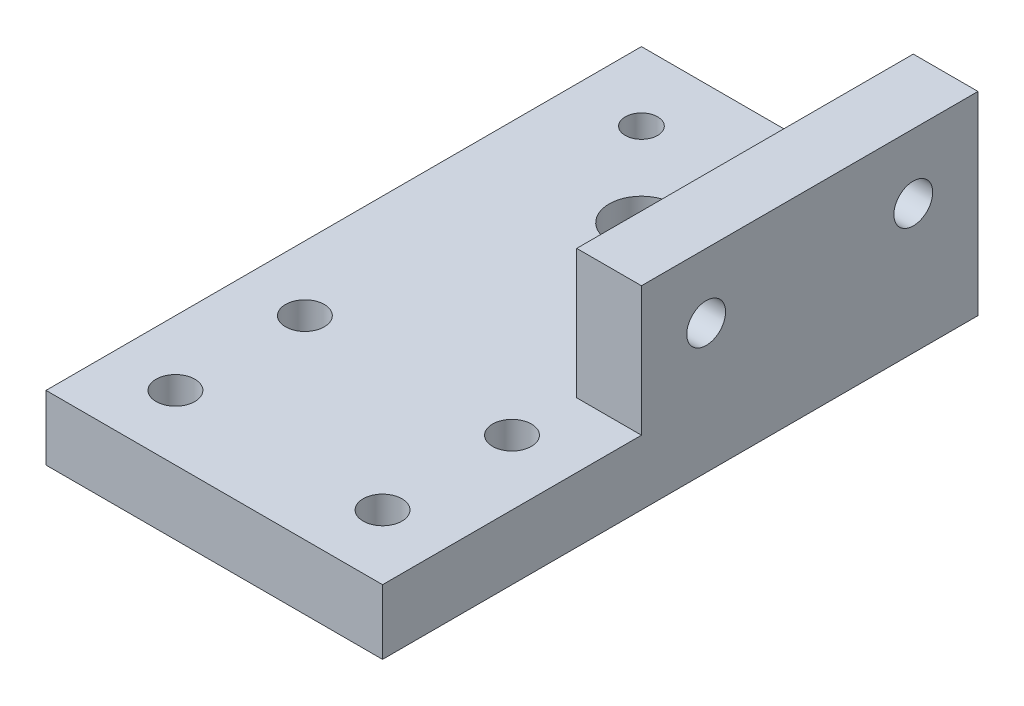
ISO-10303-21;
HEADER;
FILE_DESCRIPTION(('STEP AP214'),'2;1');
FILE_NAME('part.step','',(''),(''),'','','');
FILE_SCHEMA(('AUTOMOTIVE_DESIGN { 1 0 10303 214 1 1 1 1 }'));
ENDSEC;
DATA;
#1=APPLICATION_CONTEXT('core data for automotive mechanical design processes');
#2=APPLICATION_PROTOCOL_DEFINITION('international standard','automotive_design',2000,#1);
#3=PRODUCT_CONTEXT('',#1,'mechanical');
#4=PRODUCT('Part','Part','',(#3));
#5=PRODUCT_RELATED_PRODUCT_CATEGORY('part','',(#4));
#6=PRODUCT_DEFINITION_FORMATION('','',#4);
#7=PRODUCT_DEFINITION_CONTEXT('part definition',#1,'design');
#8=PRODUCT_DEFINITION('design','',#6,#7);
#9=PRODUCT_DEFINITION_SHAPE('','',#8);
#10=(LENGTH_UNIT() NAMED_UNIT(*) SI_UNIT(.MILLI.,.METRE.));
#11=(NAMED_UNIT(*) PLANE_ANGLE_UNIT() SI_UNIT($,.RADIAN.));
#12=(NAMED_UNIT(*) SI_UNIT($,.STERADIAN.) SOLID_ANGLE_UNIT());
#13=UNCERTAINTY_MEASURE_WITH_UNIT(LENGTH_MEASURE(1.E-05),#10,'distance_accuracy_value','');
#14=(GEOMETRIC_REPRESENTATION_CONTEXT(3) GLOBAL_UNCERTAINTY_ASSIGNED_CONTEXT((#13)) GLOBAL_UNIT_ASSIGNED_CONTEXT((#10,
#11,#12)) REPRESENTATION_CONTEXT('',''));
#15=CARTESIAN_POINT('',(0.,0.,0.));
#16=DIRECTION('',(0.,0.,1.));
#17=DIRECTION('',(1.,0.,0.));
#18=AXIS2_PLACEMENT_3D('',#15,#16,#17);
#19=CARTESIAN_POINT('',(0.,10.,-92.));
#20=DIRECTION('',(1.,0.,0.));
#21=DIRECTION('',(0.,0.,-1.));
#22=AXIS2_PLACEMENT_3D('',#19,#20,#21);
#23=PLANE('',#22);
#24=DIRECTION('',(0.,0.,1.));
#25=VECTOR('',#24,1.);
#26=CARTESIAN_POINT('',(0.,0.,-92.));
#27=LINE('',#26,#25);
#28=CARTESIAN_POINT('',(0.,0.,-92.));
#29=VERTEX_POINT('',#28);
#30=CARTESIAN_POINT('',(0.,0.,0.));
#31=VERTEX_POINT('',#30);
#32=EDGE_CURVE('E124',#29,#31,#27,.T.);
#33=ORIENTED_EDGE('',*,*,#32,.T.);
#34=DIRECTION('',(0.,-1.,0.));
#35=VECTOR('',#34,1.);
#36=CARTESIAN_POINT('',(0.,10.,0.));
#37=LINE('',#36,#35);
#38=CARTESIAN_POINT('',(0.,10.,0.));
#39=VERTEX_POINT('',#38);
#40=EDGE_CURVE('E11',#39,#31,#37,.T.);
#41=ORIENTED_EDGE('',*,*,#40,.F.);
#42=DIRECTION('',(0.,0.,1.));
#43=VECTOR('',#42,1.);
#44=CARTESIAN_POINT('',(0.,10.,-92.));
#45=LINE('',#44,#43);
#46=CARTESIAN_POINT('',(0.,10.,-92.));
#47=VERTEX_POINT('',#46);
#48=EDGE_CURVE('E135',#47,#39,#45,.T.);
#49=ORIENTED_EDGE('',*,*,#48,.F.);
#50=DIRECTION('',(0.,-1.,0.));
#51=VECTOR('',#50,1.);
#52=CARTESIAN_POINT('',(0.,10.,-92.));
#53=LINE('',#52,#51);
#54=EDGE_CURVE('E148',#47,#29,#53,.T.);
#55=ORIENTED_EDGE('',*,*,#54,.T.);
#56=EDGE_LOOP('',(#33,#41,#49,#55));
#57=FACE_BOUND('',#56,.T.);
#58=ADVANCED_FACE('F42',(#57),#23,.F.);
#59=CARTESIAN_POINT('',(0.,10.,0.));
#60=DIRECTION('',(0.,0.,-1.));
#61=DIRECTION('',(-1.,0.,0.));
#62=AXIS2_PLACEMENT_3D('',#59,#60,#61);
#63=PLANE('',#62);
#64=DIRECTION('',(1.,0.,0.));
#65=VECTOR('',#64,1.);
#66=CARTESIAN_POINT('',(0.,0.,0.));
#67=LINE('',#66,#65);
#68=CARTESIAN_POINT('',(52.,0.,0.));
#69=VERTEX_POINT('',#68);
#70=EDGE_CURVE('E129',#31,#69,#67,.T.);
#71=ORIENTED_EDGE('',*,*,#70,.T.);
#72=DIRECTION('',(0.,-1.,0.));
#73=VECTOR('',#72,1.);
#74=CARTESIAN_POINT('',(52.,10.,0.));
#75=LINE('',#74,#73);
#76=CARTESIAN_POINT('',(52.,10.,0.));
#77=VERTEX_POINT('',#76);
#78=EDGE_CURVE('E50',#77,#69,#75,.T.);
#79=ORIENTED_EDGE('',*,*,#78,.F.);
#80=DIRECTION('',(1.,0.,0.));
#81=VECTOR('',#80,1.);
#82=CARTESIAN_POINT('',(0.,10.,0.));
#83=LINE('',#82,#81);
#84=EDGE_CURVE('E139',#39,#77,#83,.T.);
#85=ORIENTED_EDGE('',*,*,#84,.F.);
#86=ORIENTED_EDGE('',*,*,#40,.T.);
#87=EDGE_LOOP('',(#71,#79,#85,#86));
#88=FACE_BOUND('',#87,.T.);
#89=ADVANCED_FACE('F281',(#88),#63,.F.);
#90=CARTESIAN_POINT('',(52.,10.,0.));
#91=DIRECTION('',(-1.,0.,0.));
#92=DIRECTION('',(0.,0.,1.));
#93=AXIS2_PLACEMENT_3D('',#90,#91,#92);
#94=PLANE('',#93);
#95=CARTESIAN_POINT('',(52.,20.01,-50.));
#96=DIRECTION('',(-1.,0.,0.));
#97=DIRECTION('',(0.,0.,1.));
#98=AXIS2_PLACEMENT_3D('',#95,#96,#97);
#99=CIRCLE('',#98,3.);
#100=CARTESIAN_POINT('',(52.,20.01,-47.));
#101=VERTEX_POINT('',#100);
#102=EDGE_CURVE('E242',#101,#101,#99,.F.);
#103=ORIENTED_EDGE('',*,*,#102,.F.);
#104=EDGE_LOOP('',(#103));
#105=FACE_BOUND('',#104,.T.);
#106=CARTESIAN_POINT('',(52.,20.01,-82.));
#107=DIRECTION('',(-1.,0.,0.));
#108=DIRECTION('',(0.,0.,1.));
#109=AXIS2_PLACEMENT_3D('',#106,#107,#108);
#110=CIRCLE('',#109,3.00000000000001);
#111=CARTESIAN_POINT('',(52.,20.01,-79.));
#112=VERTEX_POINT('',#111);
#113=EDGE_CURVE('E254',#112,#112,#110,.F.);
#114=ORIENTED_EDGE('',*,*,#113,.F.);
#115=EDGE_LOOP('',(#114));
#116=FACE_BOUND('',#115,.T.);
#117=DIRECTION('',(0.,0.,-1.));
#118=VECTOR('',#117,1.);
#119=CARTESIAN_POINT('',(52.,0.,0.));
#120=LINE('',#119,#118);
#121=CARTESIAN_POINT('',(52.,0.,-92.));
#122=VERTEX_POINT('',#121);
#123=EDGE_CURVE('E152',#69,#122,#120,.T.);
#124=ORIENTED_EDGE('',*,*,#123,.T.);
#125=DIRECTION('',(0.,-1.,0.));
#126=VECTOR('',#125,1.);
#127=CARTESIAN_POINT('',(52.,10.,-92.));
#128=LINE('',#127,#126);
#129=CARTESIAN_POINT('',(52.,30.,-92.));
#130=VERTEX_POINT('',#129);
#131=EDGE_CURVE('E160',#130,#122,#128,.T.);
#132=ORIENTED_EDGE('',*,*,#131,.F.);
#133=DIRECTION('',(0.,0.,-1.));
#134=VECTOR('',#133,1.);
#135=CARTESIAN_POINT('',(52.,30.,-92.));
#136=LINE('',#135,#134);
#137=CARTESIAN_POINT('',(52.,30.,-40.));
#138=VERTEX_POINT('',#137);
#139=EDGE_CURVE('E110',#138,#130,#136,.T.);
#140=ORIENTED_EDGE('',*,*,#139,.F.);
#141=DIRECTION('',(0.,-1.,0.));
#142=VECTOR('',#141,1.);
#143=CARTESIAN_POINT('',(52.,30.,-40.));
#144=LINE('',#143,#142);
#145=CARTESIAN_POINT('',(52.,10.,-40.));
#146=VERTEX_POINT('',#145);
#147=EDGE_CURVE('E105',#138,#146,#144,.T.);
#148=ORIENTED_EDGE('',*,*,#147,.T.);
#149=DIRECTION('',(0.,0.,-1.));
#150=VECTOR('',#149,1.);
#151=CARTESIAN_POINT('',(52.,10.,0.));
#152=LINE('',#151,#150);
#153=EDGE_CURVE('E143',#77,#146,#152,.T.);
#154=ORIENTED_EDGE('',*,*,#153,.F.);
#155=ORIENTED_EDGE('',*,*,#78,.T.);
#156=EDGE_LOOP('',(#124,#132,#140,#148,#154,#155));
#157=FACE_BOUND('',#156,.T.);
#158=ADVANCED_FACE('F169',(#105,#116,#157),#94,.F.);
#159=CARTESIAN_POINT('',(52.,10.,-92.));
#160=DIRECTION('',(0.,0.,1.));
#161=DIRECTION('',(1.,0.,0.));
#162=AXIS2_PLACEMENT_3D('',#159,#160,#161);
#163=PLANE('',#162);
#164=DIRECTION('',(-1.,0.,0.));
#165=VECTOR('',#164,1.);
#166=CARTESIAN_POINT('',(52.,0.,-92.));
#167=LINE('',#166,#165);
#168=EDGE_CURVE('E140',#122,#29,#167,.T.);
#169=ORIENTED_EDGE('',*,*,#168,.T.);
#170=ORIENTED_EDGE('',*,*,#54,.F.);
#171=DIRECTION('',(-1.,0.,0.));
#172=VECTOR('',#171,1.);
#173=CARTESIAN_POINT('',(52.,10.,-92.));
#174=LINE('',#173,#172);
#175=CARTESIAN_POINT('',(42.,10.,-92.));
#176=VERTEX_POINT('',#175);
#177=EDGE_CURVE('E146',#176,#47,#174,.T.);
#178=ORIENTED_EDGE('',*,*,#177,.F.);
#179=DIRECTION('',(0.,-1.,0.));
#180=VECTOR('',#179,1.);
#181=CARTESIAN_POINT('',(42.,30.,-92.));
#182=LINE('',#181,#180);
#183=CARTESIAN_POINT('',(42.,30.,-92.));
#184=VERTEX_POINT('',#183);
#185=EDGE_CURVE('E131',#184,#176,#182,.T.);
#186=ORIENTED_EDGE('',*,*,#185,.F.);
#187=DIRECTION('',(-1.,0.,0.));
#188=VECTOR('',#187,1.);
#189=CARTESIAN_POINT('',(42.,30.,-92.));
#190=LINE('',#189,#188);
#191=EDGE_CURVE('E116',#130,#184,#190,.T.);
#192=ORIENTED_EDGE('',*,*,#191,.F.);
#193=ORIENTED_EDGE('',*,*,#131,.T.);
#194=EDGE_LOOP('',(#169,#170,#178,#186,#192,#193));
#195=FACE_BOUND('',#194,.T.);
#196=ADVANCED_FACE('F177',(#195),#163,.F.);
#197=CARTESIAN_POINT('',(0.,10.,0.));
#198=DIRECTION('',(0.,1.,0.));
#199=DIRECTION('',(0.,0.,1.));
#200=AXIS2_PLACEMENT_3D('',#197,#198,#199);
#201=PLANE('',#200);
#202=CARTESIAN_POINT('',(23.55,10.,-68.45));
#203=DIRECTION('',(0.,1.,0.));
#204=DIRECTION('',(0.,0.,1.));
#205=AXIS2_PLACEMENT_3D('',#202,#203,#204);
#206=CIRCLE('',#205,5.);
#207=CARTESIAN_POINT('',(23.55,10.,-63.45));
#208=VERTEX_POINT('',#207);
#209=EDGE_CURVE('E217',#208,#208,#206,.T.);
#210=ORIENTED_EDGE('',*,*,#209,.F.);
#211=EDGE_LOOP('',(#210));
#212=FACE_BOUND('',#211,.T.);
#213=CARTESIAN_POINT('',(42.,10.,-10.));
#214=DIRECTION('',(0.,1.,0.));
#215=DIRECTION('',(0.,0.,1.));
#216=AXIS2_PLACEMENT_3D('',#213,#214,#215);
#217=CIRCLE('',#216,3.);
#218=CARTESIAN_POINT('',(42.,10.,-7.));
#219=VERTEX_POINT('',#218);
#220=EDGE_CURVE('E210',#219,#219,#217,.T.);
#221=ORIENTED_EDGE('',*,*,#220,.F.);
#222=EDGE_LOOP('',(#221));
#223=FACE_BOUND('',#222,.T.);
#224=CARTESIAN_POINT('',(9.99999999999999,10.,-10.));
#225=DIRECTION('',(0.,1.,0.));
#226=DIRECTION('',(0.,0.,1.));
#227=AXIS2_PLACEMENT_3D('',#224,#225,#226);
#228=CIRCLE('',#227,3.);
#229=CARTESIAN_POINT('',(9.99999999999999,10.,-7.));
#230=VERTEX_POINT('',#229);
#231=EDGE_CURVE('E201',#230,#230,#228,.T.);
#232=ORIENTED_EDGE('',*,*,#231,.F.);
#233=EDGE_LOOP('',(#232));
#234=FACE_BOUND('',#233,.T.);
#235=CARTESIAN_POINT('',(42.,10.,-30.));
#236=DIRECTION('',(0.,1.,0.));
#237=DIRECTION('',(0.,0.,1.));
#238=AXIS2_PLACEMENT_3D('',#235,#236,#237);
#239=CIRCLE('',#238,3.);
#240=CARTESIAN_POINT('',(42.,10.,-27.));
#241=VERTEX_POINT('',#240);
#242=EDGE_CURVE('E200',#241,#241,#239,.T.);
#243=ORIENTED_EDGE('',*,*,#242,.F.);
#244=EDGE_LOOP('',(#243));
#245=FACE_BOUND('',#244,.T.);
#246=CARTESIAN_POINT('',(10.6453012433455,10.,-81.3546987566545));
#247=DIRECTION('',(0.,1.,0.));
#248=DIRECTION('',(0.,0.,1.));
#249=AXIS2_PLACEMENT_3D('',#246,#247,#248);
#250=CIRCLE('',#249,2.5);
#251=CARTESIAN_POINT('',(10.6453012433455,10.,-78.8546987566545));
#252=VERTEX_POINT('',#251);
#253=EDGE_CURVE('E226',#252,#252,#250,.T.);
#254=ORIENTED_EDGE('',*,*,#253,.F.);
#255=EDGE_LOOP('',(#254));
#256=FACE_BOUND('',#255,.T.);
#257=CARTESIAN_POINT('',(36.4546987566546,10.,-55.5453012433456));
#258=DIRECTION('',(0.,1.,0.));
#259=DIRECTION('',(0.,0.,1.));
#260=AXIS2_PLACEMENT_3D('',#257,#258,#259);
#261=CIRCLE('',#260,2.5);
#262=CARTESIAN_POINT('',(36.4546987566546,10.,-53.0453012433456));
#263=VERTEX_POINT('',#262);
#264=EDGE_CURVE('E233',#263,#263,#261,.T.);
#265=ORIENTED_EDGE('',*,*,#264,.F.);
#266=EDGE_LOOP('',(#265));
#267=FACE_BOUND('',#266,.T.);
#268=CARTESIAN_POINT('',(9.99999999999999,10.,-30.));
#269=DIRECTION('',(0.,1.,0.));
#270=DIRECTION('',(0.,0.,1.));
#271=AXIS2_PLACEMENT_3D('',#268,#269,#270);
#272=CIRCLE('',#271,3.);
#273=CARTESIAN_POINT('',(9.99999999999999,10.,-27.));
#274=VERTEX_POINT('',#273);
#275=EDGE_CURVE('E196',#274,#274,#272,.T.);
#276=ORIENTED_EDGE('',*,*,#275,.F.);
#277=EDGE_LOOP('',(#276));
#278=FACE_BOUND('',#277,.T.);
#279=DIRECTION('',(0.,0.,1.));
#280=VECTOR('',#279,1.);
#281=CARTESIAN_POINT('',(42.,10.,-92.));
#282=LINE('',#281,#280);
#283=CARTESIAN_POINT('',(42.,10.,-40.));
#284=VERTEX_POINT('',#283);
#285=EDGE_CURVE('E62',#176,#284,#282,.T.);
#286=ORIENTED_EDGE('',*,*,#285,.F.);
#287=ORIENTED_EDGE('',*,*,#177,.T.);
#288=ORIENTED_EDGE('',*,*,#48,.T.);
#289=ORIENTED_EDGE('',*,*,#84,.T.);
#290=ORIENTED_EDGE('',*,*,#153,.T.);
#291=DIRECTION('',(1.,0.,0.));
#292=VECTOR('',#291,1.);
#293=CARTESIAN_POINT('',(42.,10.,-40.));
#294=LINE('',#293,#292);
#295=EDGE_CURVE('E57',#284,#146,#294,.T.);
#296=ORIENTED_EDGE('',*,*,#295,.F.);
#297=EDGE_LOOP('',(#286,#287,#288,#289,#290,#296));
#298=FACE_BOUND('',#297,.T.);
#299=ADVANCED_FACE('F181',(#212,#223,#234,#245,#256,#267,#278,#298),#201,.T.);
#300=CARTESIAN_POINT('',(0.,0.,0.));
#301=DIRECTION('',(0.,1.,0.));
#302=DIRECTION('',(0.,0.,1.));
#303=AXIS2_PLACEMENT_3D('',#300,#301,#302);
#304=PLANE('',#303);
#305=CARTESIAN_POINT('',(23.55,0.,-68.45));
#306=DIRECTION('',(0.,1.,0.));
#307=DIRECTION('',(0.,0.,1.));
#308=AXIS2_PLACEMENT_3D('',#305,#306,#307);
#309=CIRCLE('',#308,5.);
#310=CARTESIAN_POINT('',(23.55,0.,-63.45));
#311=VERTEX_POINT('',#310);
#312=EDGE_CURVE('E222',#311,#311,#309,.F.);
#313=ORIENTED_EDGE('',*,*,#312,.F.);
#314=EDGE_LOOP('',(#313));
#315=FACE_BOUND('',#314,.T.);
#316=CARTESIAN_POINT('',(42.,0.,-10.));
#317=DIRECTION('',(0.,1.,0.));
#318=DIRECTION('',(0.,0.,1.));
#319=AXIS2_PLACEMENT_3D('',#316,#317,#318);
#320=CIRCLE('',#319,3.);
#321=CARTESIAN_POINT('',(42.,0.,-7.));
#322=VERTEX_POINT('',#321);
#323=EDGE_CURVE('E221',#322,#322,#320,.F.);
#324=ORIENTED_EDGE('',*,*,#323,.F.);
#325=EDGE_LOOP('',(#324));
#326=FACE_BOUND('',#325,.T.);
#327=CARTESIAN_POINT('',(9.99999999999999,0.,-10.));
#328=DIRECTION('',(0.,1.,0.));
#329=DIRECTION('',(0.,0.,1.));
#330=AXIS2_PLACEMENT_3D('',#327,#328,#329);
#331=CIRCLE('',#330,3.);
#332=CARTESIAN_POINT('',(9.99999999999999,0.,-7.));
#333=VERTEX_POINT('',#332);
#334=EDGE_CURVE('E206',#333,#333,#331,.F.);
#335=ORIENTED_EDGE('',*,*,#334,.F.);
#336=EDGE_LOOP('',(#335));
#337=FACE_BOUND('',#336,.T.);
#338=CARTESIAN_POINT('',(42.,0.,-30.));
#339=DIRECTION('',(0.,1.,0.));
#340=DIRECTION('',(0.,0.,1.));
#341=AXIS2_PLACEMENT_3D('',#338,#339,#340);
#342=CIRCLE('',#341,3.);
#343=CARTESIAN_POINT('',(42.,0.,-27.));
#344=VERTEX_POINT('',#343);
#345=EDGE_CURVE('E205',#344,#344,#342,.F.);
#346=ORIENTED_EDGE('',*,*,#345,.F.);
#347=EDGE_LOOP('',(#346));
#348=FACE_BOUND('',#347,.T.);
#349=CARTESIAN_POINT('',(10.6453012433455,0.,-81.3546987566545));
#350=DIRECTION('',(0.,1.,0.));
#351=DIRECTION('',(0.,0.,1.));
#352=AXIS2_PLACEMENT_3D('',#349,#350,#351);
#353=CIRCLE('',#352,2.5);
#354=CARTESIAN_POINT('',(10.6453012433455,0.,-78.8546987566545));
#355=VERTEX_POINT('',#354);
#356=EDGE_CURVE('E237',#355,#355,#353,.F.);
#357=ORIENTED_EDGE('',*,*,#356,.F.);
#358=EDGE_LOOP('',(#357));
#359=FACE_BOUND('',#358,.T.);
#360=CARTESIAN_POINT('',(36.4546987566546,0.,-55.5453012433456));
#361=DIRECTION('',(0.,1.,0.));
#362=DIRECTION('',(0.,0.,1.));
#363=AXIS2_PLACEMENT_3D('',#360,#361,#362);
#364=CIRCLE('',#363,2.5);
#365=CARTESIAN_POINT('',(36.4546987566546,0.,-53.0453012433456));
#366=VERTEX_POINT('',#365);
#367=EDGE_CURVE('E238',#366,#366,#364,.F.);
#368=ORIENTED_EDGE('',*,*,#367,.F.);
#369=EDGE_LOOP('',(#368));
#370=FACE_BOUND('',#369,.T.);
#371=CARTESIAN_POINT('',(9.99999999999999,0.,-30.));
#372=DIRECTION('',(0.,1.,0.));
#373=DIRECTION('',(0.,0.,1.));
#374=AXIS2_PLACEMENT_3D('',#371,#372,#373);
#375=CIRCLE('',#374,3.);
#376=CARTESIAN_POINT('',(9.99999999999999,0.,-27.));
#377=VERTEX_POINT('',#376);
#378=EDGE_CURVE('E189',#377,#377,#375,.F.);
#379=ORIENTED_EDGE('',*,*,#378,.F.);
#380=EDGE_LOOP('',(#379));
#381=FACE_BOUND('',#380,.T.);
#382=ORIENTED_EDGE('',*,*,#32,.F.);
#383=ORIENTED_EDGE('',*,*,#168,.F.);
#384=ORIENTED_EDGE('',*,*,#123,.F.);
#385=ORIENTED_EDGE('',*,*,#70,.F.);
#386=EDGE_LOOP('',(#382,#383,#384,#385));
#387=FACE_BOUND('',#386,.T.);
#388=ADVANCED_FACE('F174',(#315,#326,#337,#348,#359,#370,#381,#387),#304,.F.);
#389=CARTESIAN_POINT('',(42.,30.,-92.));
#390=DIRECTION('',(1.,0.,0.));
#391=DIRECTION('',(0.,0.,-1.));
#392=AXIS2_PLACEMENT_3D('',#389,#390,#391);
#393=PLANE('',#392);
#394=CARTESIAN_POINT('',(42.,20.01,-50.));
#395=DIRECTION('',(-1.,0.,0.));
#396=DIRECTION('',(0.,0.,1.));
#397=AXIS2_PLACEMENT_3D('',#394,#395,#396);
#398=CIRCLE('',#397,3.);
#399=CARTESIAN_POINT('',(42.,20.01,-47.));
#400=VERTEX_POINT('',#399);
#401=EDGE_CURVE('E253',#400,#400,#398,.T.);
#402=ORIENTED_EDGE('',*,*,#401,.F.);
#403=EDGE_LOOP('',(#402));
#404=FACE_BOUND('',#403,.T.);
#405=CARTESIAN_POINT('',(42.,20.01,-82.));
#406=DIRECTION('',(-1.,0.,0.));
#407=DIRECTION('',(0.,0.,1.));
#408=AXIS2_PLACEMENT_3D('',#405,#406,#407);
#409=CIRCLE('',#408,3.00000000000001);
#410=CARTESIAN_POINT('',(42.,20.01,-79.));
#411=VERTEX_POINT('',#410);
#412=EDGE_CURVE('E249',#411,#411,#409,.T.);
#413=ORIENTED_EDGE('',*,*,#412,.F.);
#414=EDGE_LOOP('',(#413));
#415=FACE_BOUND('',#414,.T.);
#416=ORIENTED_EDGE('',*,*,#285,.T.);
#417=DIRECTION('',(0.,-1.,0.));
#418=VECTOR('',#417,1.);
#419=CARTESIAN_POINT('',(42.,30.,-40.));
#420=LINE('',#419,#418);
#421=CARTESIAN_POINT('',(42.,30.,-40.));
#422=VERTEX_POINT('',#421);
#423=EDGE_CURVE('E103',#422,#284,#420,.T.);
#424=ORIENTED_EDGE('',*,*,#423,.F.);
#425=DIRECTION('',(0.,0.,1.));
#426=VECTOR('',#425,1.);
#427=CARTESIAN_POINT('',(42.,30.,-92.));
#428=LINE('',#427,#426);
#429=EDGE_CURVE('E111',#184,#422,#428,.T.);
#430=ORIENTED_EDGE('',*,*,#429,.F.);
#431=ORIENTED_EDGE('',*,*,#185,.T.);
#432=EDGE_LOOP('',(#416,#424,#430,#431));
#433=FACE_BOUND('',#432,.T.);
#434=ADVANCED_FACE('F122',(#404,#415,#433),#393,.F.);
#435=CARTESIAN_POINT('',(42.,30.,-40.));
#436=DIRECTION('',(0.,0.,-1.));
#437=DIRECTION('',(-1.,0.,0.));
#438=AXIS2_PLACEMENT_3D('',#435,#436,#437);
#439=PLANE('',#438);
#440=ORIENTED_EDGE('',*,*,#295,.T.);
#441=ORIENTED_EDGE('',*,*,#147,.F.);
#442=DIRECTION('',(1.,0.,0.));
#443=VECTOR('',#442,1.);
#444=CARTESIAN_POINT('',(42.,30.,-40.));
#445=LINE('',#444,#443);
#446=EDGE_CURVE('E99',#422,#138,#445,.T.);
#447=ORIENTED_EDGE('',*,*,#446,.F.);
#448=ORIENTED_EDGE('',*,*,#423,.T.);
#449=EDGE_LOOP('',(#440,#441,#447,#448));
#450=FACE_BOUND('',#449,.T.);
#451=ADVANCED_FACE('F101',(#450),#439,.F.);
#452=CARTESIAN_POINT('',(0.,30.,0.));
#453=DIRECTION('',(0.,1.,0.));
#454=DIRECTION('',(0.,0.,1.));
#455=AXIS2_PLACEMENT_3D('',#452,#453,#454);
#456=PLANE('',#455);
#457=ORIENTED_EDGE('',*,*,#429,.T.);
#458=ORIENTED_EDGE('',*,*,#446,.T.);
#459=ORIENTED_EDGE('',*,*,#139,.T.);
#460=ORIENTED_EDGE('',*,*,#191,.T.);
#461=EDGE_LOOP('',(#457,#458,#459,#460));
#462=FACE_BOUND('',#461,.T.);
#463=ADVANCED_FACE('F114',(#462),#456,.T.);
#464=CARTESIAN_POINT('',(9.99999999999999,-0.000999999999999265,-30.));
#465=DIRECTION('',(0.,1.,0.));
#466=DIRECTION('',(0.,0.,1.));
#467=AXIS2_PLACEMENT_3D('',#464,#465,#466);
#468=CYLINDRICAL_SURFACE('',#467,3.);
#469=ORIENTED_EDGE('',*,*,#275,.T.);
#470=EDGE_LOOP('',(#469));
#471=FACE_BOUND('',#470,.T.);
#472=ORIENTED_EDGE('',*,*,#378,.T.);
#473=EDGE_LOOP('',(#472));
#474=FACE_BOUND('',#473,.T.);
#475=ADVANCED_FACE('F342',(#471,#474),#468,.F.);
#476=CARTESIAN_POINT('',(36.4546987566546,-0.000999999999999265,-55.5453012433456));
#477=DIRECTION('',(0.,1.,0.));
#478=DIRECTION('',(0.,0.,1.));
#479=AXIS2_PLACEMENT_3D('',#476,#477,#478);
#480=CYLINDRICAL_SURFACE('',#479,2.5);
#481=ORIENTED_EDGE('',*,*,#264,.T.);
#482=EDGE_LOOP('',(#481));
#483=FACE_BOUND('',#482,.T.);
#484=ORIENTED_EDGE('',*,*,#367,.T.);
#485=EDGE_LOOP('',(#484));
#486=FACE_BOUND('',#485,.T.);
#487=ADVANCED_FACE('F348',(#483,#486),#480,.F.);
#488=CARTESIAN_POINT('',(10.6453012433455,-0.000999999999999265,-81.3546987566545));
#489=DIRECTION('',(0.,1.,0.));
#490=DIRECTION('',(0.,0.,1.));
#491=AXIS2_PLACEMENT_3D('',#488,#489,#490);
#492=CYLINDRICAL_SURFACE('',#491,2.5);
#493=ORIENTED_EDGE('',*,*,#253,.T.);
#494=EDGE_LOOP('',(#493));
#495=FACE_BOUND('',#494,.T.);
#496=ORIENTED_EDGE('',*,*,#356,.T.);
#497=EDGE_LOOP('',(#496));
#498=FACE_BOUND('',#497,.T.);
#499=ADVANCED_FACE('F356',(#495,#498),#492,.F.);
#500=CARTESIAN_POINT('',(42.,-0.000999999999999265,-30.));
#501=DIRECTION('',(0.,1.,0.));
#502=DIRECTION('',(0.,0.,1.));
#503=AXIS2_PLACEMENT_3D('',#500,#501,#502);
#504=CYLINDRICAL_SURFACE('',#503,3.);
#505=ORIENTED_EDGE('',*,*,#242,.T.);
#506=EDGE_LOOP('',(#505));
#507=FACE_BOUND('',#506,.T.);
#508=ORIENTED_EDGE('',*,*,#345,.T.);
#509=EDGE_LOOP('',(#508));
#510=FACE_BOUND('',#509,.T.);
#511=ADVANCED_FACE('F364',(#507,#510),#504,.F.);
#512=CARTESIAN_POINT('',(9.99999999999999,-0.000999999999999265,-10.));
#513=DIRECTION('',(0.,1.,0.));
#514=DIRECTION('',(0.,0.,1.));
#515=AXIS2_PLACEMENT_3D('',#512,#513,#514);
#516=CYLINDRICAL_SURFACE('',#515,3.);
#517=ORIENTED_EDGE('',*,*,#231,.T.);
#518=EDGE_LOOP('',(#517));
#519=FACE_BOUND('',#518,.T.);
#520=ORIENTED_EDGE('',*,*,#334,.T.);
#521=EDGE_LOOP('',(#520));
#522=FACE_BOUND('',#521,.T.);
#523=ADVANCED_FACE('F372',(#519,#522),#516,.F.);
#524=CARTESIAN_POINT('',(42.,-0.000999999999999265,-10.));
#525=DIRECTION('',(0.,1.,0.));
#526=DIRECTION('',(0.,0.,1.));
#527=AXIS2_PLACEMENT_3D('',#524,#525,#526);
#528=CYLINDRICAL_SURFACE('',#527,3.);
#529=ORIENTED_EDGE('',*,*,#220,.T.);
#530=EDGE_LOOP('',(#529));
#531=FACE_BOUND('',#530,.T.);
#532=ORIENTED_EDGE('',*,*,#323,.T.);
#533=EDGE_LOOP('',(#532));
#534=FACE_BOUND('',#533,.T.);
#535=ADVANCED_FACE('F380',(#531,#534),#528,.F.);
#536=CARTESIAN_POINT('',(23.55,-0.000999999999999265,-68.45));
#537=DIRECTION('',(0.,1.,0.));
#538=DIRECTION('',(0.,0.,1.));
#539=AXIS2_PLACEMENT_3D('',#536,#537,#538);
#540=CYLINDRICAL_SURFACE('',#539,5.);
#541=ORIENTED_EDGE('',*,*,#209,.T.);
#542=EDGE_LOOP('',(#541));
#543=FACE_BOUND('',#542,.T.);
#544=ORIENTED_EDGE('',*,*,#312,.T.);
#545=EDGE_LOOP('',(#544));
#546=FACE_BOUND('',#545,.T.);
#547=ADVANCED_FACE('F276',(#543,#546),#540,.F.);
#548=CARTESIAN_POINT('',(52.001,20.01,-82.));
#549=DIRECTION('',(-1.,0.,0.));
#550=DIRECTION('',(0.,0.,1.));
#551=AXIS2_PLACEMENT_3D('',#548,#549,#550);
#552=CYLINDRICAL_SURFACE('',#551,3.00000000000001);
#553=ORIENTED_EDGE('',*,*,#412,.T.);
#554=EDGE_LOOP('',(#553));
#555=FACE_BOUND('',#554,.T.);
#556=ORIENTED_EDGE('',*,*,#113,.T.);
#557=EDGE_LOOP('',(#556));
#558=FACE_BOUND('',#557,.T.);
#559=ADVANCED_FACE('F273',(#555,#558),#552,.F.);
#560=CARTESIAN_POINT('',(52.001,20.01,-50.));
#561=DIRECTION('',(-1.,0.,0.));
#562=DIRECTION('',(0.,0.,1.));
#563=AXIS2_PLACEMENT_3D('',#560,#561,#562);
#564=CYLINDRICAL_SURFACE('',#563,3.);
#565=ORIENTED_EDGE('',*,*,#401,.T.);
#566=EDGE_LOOP('',(#565));
#567=FACE_BOUND('',#566,.T.);
#568=ORIENTED_EDGE('',*,*,#102,.T.);
#569=EDGE_LOOP('',(#568));
#570=FACE_BOUND('',#569,.T.);
#571=ADVANCED_FACE('F265',(#567,#570),#564,.F.);
#572=CLOSED_SHELL('',(#58,#89,#158,#196,#299,#388,#434,#451,#463,#475,#487,#499,#511,#523,#535,
#547,#559,#571));
#573=MANIFOLD_SOLID_BREP('B2',#572);
#574=ADVANCED_BREP_SHAPE_REPRESENTATION('',(#18,#573),#14);
#575=SHAPE_DEFINITION_REPRESENTATION(#9,#574);
ENDSEC;
END-ISO-10303-21;
